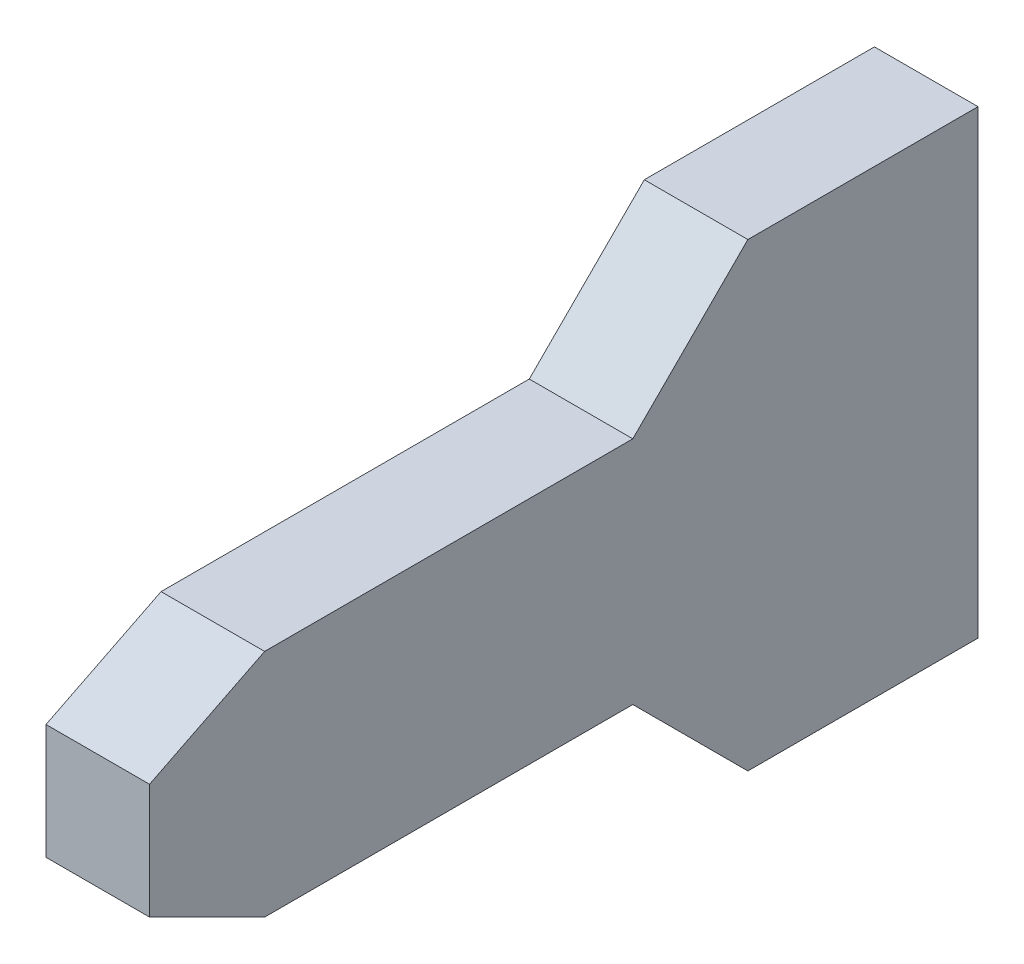
ISO-10303-21;
HEADER;
FILE_DESCRIPTION(('STEP AP214'),'2;1');
FILE_NAME('part.step','',(''),(''),'','','');
FILE_SCHEMA(('AUTOMOTIVE_DESIGN { 1 0 10303 214 1 1 1 1 }'));
ENDSEC;
DATA;
#1=APPLICATION_CONTEXT('core data for automotive mechanical design processes');
#2=APPLICATION_PROTOCOL_DEFINITION('international standard','automotive_design',2000,#1);
#3=PRODUCT_CONTEXT('',#1,'mechanical');
#4=PRODUCT('Part','Part','',(#3));
#5=PRODUCT_RELATED_PRODUCT_CATEGORY('part','',(#4));
#6=PRODUCT_DEFINITION_FORMATION('','',#4);
#7=PRODUCT_DEFINITION_CONTEXT('part definition',#1,'design');
#8=PRODUCT_DEFINITION('design','',#6,#7);
#9=PRODUCT_DEFINITION_SHAPE('','',#8);
#10=(LENGTH_UNIT() NAMED_UNIT(*) SI_UNIT(.MILLI.,.METRE.));
#11=(NAMED_UNIT(*) PLANE_ANGLE_UNIT() SI_UNIT($,.RADIAN.));
#12=(NAMED_UNIT(*) SI_UNIT($,.STERADIAN.) SOLID_ANGLE_UNIT());
#13=UNCERTAINTY_MEASURE_WITH_UNIT(LENGTH_MEASURE(1.E-05),#10,'distance_accuracy_value','');
#14=(GEOMETRIC_REPRESENTATION_CONTEXT(3) GLOBAL_UNCERTAINTY_ASSIGNED_CONTEXT((#13)) GLOBAL_UNIT_ASSIGNED_CONTEXT((#10,
#11,#12)) REPRESENTATION_CONTEXT('',''));
#15=CARTESIAN_POINT('',(0.,0.,0.));
#16=DIRECTION('',(0.,0.,1.));
#17=DIRECTION('',(1.,0.,0.));
#18=AXIS2_PLACEMENT_3D('',#15,#16,#17);
#19=CARTESIAN_POINT('',(0.45,0.,0.531743708992));
#20=DIRECTION('',(1.,0.,0.));
#21=DIRECTION('',(0.,1.,0.));
#22=AXIS2_PLACEMENT_3D('',#19,#20,#21);
#23=PLANE('',#22);
#24=DIRECTION('',(0.,0.,1.));
#25=VECTOR('',#24,1.);
#26=CARTESIAN_POINT('',(0.45,-0.5,0.531743708992));
#27=LINE('',#26,#25);
#28=CARTESIAN_POINT('',(0.45,-0.5,2.1));
#29=VERTEX_POINT('',#28);
#30=CARTESIAN_POINT('',(0.45,-0.5,0.5));
#31=VERTEX_POINT('',#30);
#32=EDGE_CURVE('E121',#29,#31,#27,.F.);
#33=ORIENTED_EDGE('',*,*,#32,.T.);
#34=DIRECTION('',(0.,-0.707106781186548,-0.707106781186547));
#35=VECTOR('',#34,1.);
#36=CARTESIAN_POINT('',(0.45,-0.5,0.5));
#37=LINE('',#36,#35);
#38=CARTESIAN_POINT('',(0.45,-1.,0.));
#39=VERTEX_POINT('',#38);
#40=EDGE_CURVE('E123',#31,#39,#37,.T.);
#41=ORIENTED_EDGE('',*,*,#40,.T.);
#42=DIRECTION('',(0.,0.,1.));
#43=VECTOR('',#42,1.);
#44=CARTESIAN_POINT('',(0.45,-1.,-1.));
#45=LINE('',#44,#43);
#46=CARTESIAN_POINT('',(0.45,-1.,-1.));
#47=VERTEX_POINT('',#46);
#48=EDGE_CURVE('E125',#47,#39,#45,.T.);
#49=ORIENTED_EDGE('',*,*,#48,.F.);
#50=DIRECTION('',(0.,1.,0.));
#51=VECTOR('',#50,1.);
#52=CARTESIAN_POINT('',(0.45,1.,-1.));
#53=LINE('',#52,#51);
#54=CARTESIAN_POINT('',(0.45,1.,-1.));
#55=VERTEX_POINT('',#54);
#56=EDGE_CURVE('E96',#55,#47,#53,.F.);
#57=ORIENTED_EDGE('',*,*,#56,.F.);
#58=DIRECTION('',(0.,0.,1.));
#59=VECTOR('',#58,1.);
#60=CARTESIAN_POINT('',(0.45,1.,0.531743708992));
#61=LINE('',#60,#59);
#62=CARTESIAN_POINT('',(0.45,1.,0.));
#63=VERTEX_POINT('',#62);
#64=EDGE_CURVE('E20',#55,#63,#61,.T.);
#65=ORIENTED_EDGE('',*,*,#64,.T.);
#66=DIRECTION('',(0.,-0.707106781186548,0.707106781186548));
#67=VECTOR('',#66,1.);
#68=CARTESIAN_POINT('',(0.450000000000001,1.,0.));
#69=LINE('',#68,#67);
#70=CARTESIAN_POINT('',(0.45,0.5,0.5));
#71=VERTEX_POINT('',#70);
#72=EDGE_CURVE('E91',#63,#71,#69,.T.);
#73=ORIENTED_EDGE('',*,*,#72,.T.);
#74=DIRECTION('',(0.,0.,1.));
#75=VECTOR('',#74,1.);
#76=CARTESIAN_POINT('',(0.45,0.5,0.531743708992));
#77=LINE('',#76,#75);
#78=CARTESIAN_POINT('',(0.45,0.5,2.1));
#79=VERTEX_POINT('',#78);
#80=EDGE_CURVE('E112',#71,#79,#77,.T.);
#81=ORIENTED_EDGE('',*,*,#80,.T.);
#82=DIRECTION('',(0.,-0.447213595499958,0.894427190999916));
#83=VECTOR('',#82,1.);
#84=CARTESIAN_POINT('',(0.45,0.5,2.1));
#85=LINE('',#84,#83);
#86=CARTESIAN_POINT('',(0.45,0.25,2.6));
#87=VERTEX_POINT('',#86);
#88=EDGE_CURVE('E113',#79,#87,#85,.T.);
#89=ORIENTED_EDGE('',*,*,#88,.T.);
#90=DIRECTION('',(0.,1.,0.));
#91=VECTOR('',#90,1.);
#92=CARTESIAN_POINT('',(0.45,0.,2.6));
#93=LINE('',#92,#91);
#94=CARTESIAN_POINT('',(0.45,-0.25,2.6));
#95=VERTEX_POINT('',#94);
#96=EDGE_CURVE('E117',#87,#95,#93,.F.);
#97=ORIENTED_EDGE('',*,*,#96,.T.);
#98=DIRECTION('',(0.,-0.447213595499958,-0.894427190999916));
#99=VECTOR('',#98,1.);
#100=CARTESIAN_POINT('',(0.45,-0.25,2.6));
#101=LINE('',#100,#99);
#102=EDGE_CURVE('E119',#95,#29,#101,.T.);
#103=ORIENTED_EDGE('',*,*,#102,.T.);
#104=EDGE_LOOP('',(#33,#41,#49,#57,#65,#73,#81,#89,#97,#103));
#105=FACE_BOUND('',#104,.T.);
#106=ADVANCED_FACE('F17',(#105),#23,.T.);
#107=CARTESIAN_POINT('',(0.,-1.,-1.));
#108=DIRECTION('',(0.,-1.,0.));
#109=DIRECTION('',(1.,0.,0.));
#110=AXIS2_PLACEMENT_3D('',#107,#108,#109);
#111=PLANE('',#110);
#112=DIRECTION('',(1.,0.,0.));
#113=VECTOR('',#112,1.);
#114=CARTESIAN_POINT('',(0.,-1.,0.));
#115=LINE('',#114,#113);
#116=CARTESIAN_POINT('',(0.,-1.,0.));
#117=VERTEX_POINT('',#116);
#118=EDGE_CURVE('E141',#117,#39,#115,.T.);
#119=ORIENTED_EDGE('',*,*,#118,.F.);
#120=DIRECTION('',(0.,0.,1.));
#121=VECTOR('',#120,1.);
#122=CARTESIAN_POINT('',(0.,-1.,0.531743708992));
#123=LINE('',#122,#121);
#124=CARTESIAN_POINT('',(0.,-1.,-1.));
#125=VERTEX_POINT('',#124);
#126=EDGE_CURVE('E145',#117,#125,#123,.F.);
#127=ORIENTED_EDGE('',*,*,#126,.T.);
#128=DIRECTION('',(-1.,0.,0.));
#129=VECTOR('',#128,1.);
#130=CARTESIAN_POINT('',(0.,-1.,-0.999999999999999));
#131=LINE('',#130,#129);
#132=EDGE_CURVE('E129',#47,#125,#131,.T.);
#133=ORIENTED_EDGE('',*,*,#132,.F.);
#134=ORIENTED_EDGE('',*,*,#48,.T.);
#135=EDGE_LOOP('',(#119,#127,#133,#134));
#136=FACE_BOUND('',#135,.T.);
#137=ADVANCED_FACE('F198',(#136),#111,.T.);
#138=CARTESIAN_POINT('',(0.,1.,-1.));
#139=DIRECTION('',(0.,0.,-1.));
#140=DIRECTION('',(-1.,0.,0.));
#141=AXIS2_PLACEMENT_3D('',#138,#139,#140);
#142=PLANE('',#141);
#143=ORIENTED_EDGE('',*,*,#132,.T.);
#144=DIRECTION('',(0.,1.,0.));
#145=VECTOR('',#144,1.);
#146=CARTESIAN_POINT('',(0.,0.,-1.));
#147=LINE('',#146,#145);
#148=CARTESIAN_POINT('',(0.,1.,-1.));
#149=VERTEX_POINT('',#148);
#150=EDGE_CURVE('E148',#125,#149,#147,.T.);
#151=ORIENTED_EDGE('',*,*,#150,.T.);
#152=DIRECTION('',(-1.,0.,0.));
#153=VECTOR('',#152,1.);
#154=CARTESIAN_POINT('',(0.,1.,-1.));
#155=LINE('',#154,#153);
#156=EDGE_CURVE('E108',#55,#149,#155,.T.);
#157=ORIENTED_EDGE('',*,*,#156,.F.);
#158=ORIENTED_EDGE('',*,*,#56,.T.);
#159=EDGE_LOOP('',(#143,#151,#157,#158));
#160=FACE_BOUND('',#159,.T.);
#161=ADVANCED_FACE('F194',(#160),#142,.T.);
#162=CARTESIAN_POINT('',(0.,1.,0.));
#163=DIRECTION('',(0.,1.,0.));
#164=DIRECTION('',(-1.,0.,0.));
#165=AXIS2_PLACEMENT_3D('',#162,#163,#164);
#166=PLANE('',#165);
#167=ORIENTED_EDGE('',*,*,#156,.T.);
#168=DIRECTION('',(0.,0.,1.));
#169=VECTOR('',#168,1.);
#170=CARTESIAN_POINT('',(0.,1.,0.531743708992));
#171=LINE('',#170,#169);
#172=CARTESIAN_POINT('',(0.,1.,0.));
#173=VERTEX_POINT('',#172);
#174=EDGE_CURVE('E103',#149,#173,#171,.T.);
#175=ORIENTED_EDGE('',*,*,#174,.T.);
#176=DIRECTION('',(1.,0.,0.));
#177=VECTOR('',#176,1.);
#178=CARTESIAN_POINT('',(0.,1.,0.));
#179=LINE('',#178,#177);
#180=EDGE_CURVE('E100',#63,#173,#179,.F.);
#181=ORIENTED_EDGE('',*,*,#180,.F.);
#182=ORIENTED_EDGE('',*,*,#64,.F.);
#183=EDGE_LOOP('',(#167,#175,#181,#182));
#184=FACE_BOUND('',#183,.T.);
#185=ADVANCED_FACE('F101',(#184),#166,.T.);
#186=CARTESIAN_POINT('',(0.,0.5,0.5));
#187=DIRECTION('',(0.,0.707106781186548,0.707106781186548));
#188=DIRECTION('',(0.,-0.707106781186548,0.707106781186548));
#189=AXIS2_PLACEMENT_3D('',#186,#187,#188);
#190=PLANE('',#189);
#191=ORIENTED_EDGE('',*,*,#180,.T.);
#192=DIRECTION('',(0.,-0.707106781186548,0.707106781186548));
#193=VECTOR('',#192,1.);
#194=CARTESIAN_POINT('',(0.,1.,0.));
#195=LINE('',#194,#193);
#196=CARTESIAN_POINT('',(0.,0.5,0.5));
#197=VERTEX_POINT('',#196);
#198=EDGE_CURVE('E152',#173,#197,#195,.T.);
#199=ORIENTED_EDGE('',*,*,#198,.T.);
#200=DIRECTION('',(-1.,0.,0.));
#201=VECTOR('',#200,1.);
#202=CARTESIAN_POINT('',(0.,0.5,0.5));
#203=LINE('',#202,#201);
#204=EDGE_CURVE('E107',#71,#197,#203,.T.);
#205=ORIENTED_EDGE('',*,*,#204,.F.);
#206=ORIENTED_EDGE('',*,*,#72,.F.);
#207=EDGE_LOOP('',(#191,#199,#205,#206));
#208=FACE_BOUND('',#207,.T.);
#209=ADVANCED_FACE('F110',(#208),#190,.T.);
#210=CARTESIAN_POINT('',(0.,0.5,2.1));
#211=DIRECTION('',(0.,1.,0.));
#212=DIRECTION('',(-1.,0.,0.));
#213=AXIS2_PLACEMENT_3D('',#210,#211,#212);
#214=PLANE('',#213);
#215=ORIENTED_EDGE('',*,*,#204,.T.);
#216=DIRECTION('',(0.,0.,1.));
#217=VECTOR('',#216,1.);
#218=CARTESIAN_POINT('',(0.,0.5,0.531743708992));
#219=LINE('',#218,#217);
#220=CARTESIAN_POINT('',(0.,0.5,2.1));
#221=VERTEX_POINT('',#220);
#222=EDGE_CURVE('E154',#197,#221,#219,.T.);
#223=ORIENTED_EDGE('',*,*,#222,.T.);
#224=DIRECTION('',(1.,0.,0.));
#225=VECTOR('',#224,1.);
#226=CARTESIAN_POINT('',(0.,0.5,2.1));
#227=LINE('',#226,#225);
#228=EDGE_CURVE('E133',#79,#221,#227,.F.);
#229=ORIENTED_EDGE('',*,*,#228,.F.);
#230=ORIENTED_EDGE('',*,*,#80,.F.);
#231=EDGE_LOOP('',(#215,#223,#229,#230));
#232=FACE_BOUND('',#231,.T.);
#233=ADVANCED_FACE('F191',(#232),#214,.T.);
#234=CARTESIAN_POINT('',(0.,0.25,2.6));
#235=DIRECTION('',(0.,0.894427190999916,0.447213595499958));
#236=DIRECTION('',(0.,-0.447213595499958,0.894427190999916));
#237=AXIS2_PLACEMENT_3D('',#234,#235,#236);
#238=PLANE('',#237);
#239=ORIENTED_EDGE('',*,*,#228,.T.);
#240=DIRECTION('',(0.,-0.447213595499958,0.894427190999916));
#241=VECTOR('',#240,1.);
#242=CARTESIAN_POINT('',(0.,0.5,2.1));
#243=LINE('',#242,#241);
#244=CARTESIAN_POINT('',(0.,0.25,2.6));
#245=VERTEX_POINT('',#244);
#246=EDGE_CURVE('E157',#221,#245,#243,.T.);
#247=ORIENTED_EDGE('',*,*,#246,.T.);
#248=DIRECTION('',(1.,0.,0.));
#249=VECTOR('',#248,1.);
#250=CARTESIAN_POINT('',(0.,0.25,2.6));
#251=LINE('',#250,#249);
#252=EDGE_CURVE('E135',#87,#245,#251,.F.);
#253=ORIENTED_EDGE('',*,*,#252,.F.);
#254=ORIENTED_EDGE('',*,*,#88,.F.);
#255=EDGE_LOOP('',(#239,#247,#253,#254));
#256=FACE_BOUND('',#255,.T.);
#257=ADVANCED_FACE('F187',(#256),#238,.T.);
#258=CARTESIAN_POINT('',(0.,-0.25,2.6));
#259=DIRECTION('',(0.,0.,1.));
#260=DIRECTION('',(0.,-1.,0.));
#261=AXIS2_PLACEMENT_3D('',#258,#259,#260);
#262=PLANE('',#261);
#263=ORIENTED_EDGE('',*,*,#252,.T.);
#264=DIRECTION('',(0.,1.,0.));
#265=VECTOR('',#264,1.);
#266=CARTESIAN_POINT('',(0.,0.,2.6));
#267=LINE('',#266,#265);
#268=CARTESIAN_POINT('',(0.,-0.25,2.6));
#269=VERTEX_POINT('',#268);
#270=EDGE_CURVE('E160',#245,#269,#267,.F.);
#271=ORIENTED_EDGE('',*,*,#270,.T.);
#272=DIRECTION('',(1.,0.,0.));
#273=VECTOR('',#272,1.);
#274=CARTESIAN_POINT('',(0.,-0.25,2.6));
#275=LINE('',#274,#273);
#276=EDGE_CURVE('E137',#95,#269,#275,.F.);
#277=ORIENTED_EDGE('',*,*,#276,.F.);
#278=ORIENTED_EDGE('',*,*,#96,.F.);
#279=EDGE_LOOP('',(#263,#271,#277,#278));
#280=FACE_BOUND('',#279,.T.);
#281=ADVANCED_FACE('F182',(#280),#262,.T.);
#282=CARTESIAN_POINT('',(0.,-0.5,2.1));
#283=DIRECTION('',(0.,-0.894427190999916,0.447213595499958));
#284=DIRECTION('',(0.,-0.447213595499958,-0.894427190999916));
#285=AXIS2_PLACEMENT_3D('',#282,#283,#284);
#286=PLANE('',#285);
#287=ORIENTED_EDGE('',*,*,#276,.T.);
#288=DIRECTION('',(0.,-0.447213595499958,-0.894427190999916));
#289=VECTOR('',#288,1.);
#290=CARTESIAN_POINT('',(0.,-0.25,2.6));
#291=LINE('',#290,#289);
#292=CARTESIAN_POINT('',(0.,-0.5,2.1));
#293=VERTEX_POINT('',#292);
#294=EDGE_CURVE('E163',#269,#293,#291,.T.);
#295=ORIENTED_EDGE('',*,*,#294,.T.);
#296=DIRECTION('',(1.,0.,0.));
#297=VECTOR('',#296,1.);
#298=CARTESIAN_POINT('',(0.,-0.5,2.1));
#299=LINE('',#298,#297);
#300=EDGE_CURVE('E139',#29,#293,#299,.F.);
#301=ORIENTED_EDGE('',*,*,#300,.F.);
#302=ORIENTED_EDGE('',*,*,#102,.F.);
#303=EDGE_LOOP('',(#287,#295,#301,#302));
#304=FACE_BOUND('',#303,.T.);
#305=ADVANCED_FACE('F177',(#304),#286,.T.);
#306=CARTESIAN_POINT('',(0.,-0.5,0.5));
#307=DIRECTION('',(0.,-1.,0.));
#308=DIRECTION('',(1.,0.,0.));
#309=AXIS2_PLACEMENT_3D('',#306,#307,#308);
#310=PLANE('',#309);
#311=ORIENTED_EDGE('',*,*,#300,.T.);
#312=DIRECTION('',(0.,0.,1.));
#313=VECTOR('',#312,1.);
#314=CARTESIAN_POINT('',(0.,-0.5,0.531743708992));
#315=LINE('',#314,#313);
#316=CARTESIAN_POINT('',(0.,-0.5,0.5));
#317=VERTEX_POINT('',#316);
#318=EDGE_CURVE('E26',#293,#317,#315,.F.);
#319=ORIENTED_EDGE('',*,*,#318,.T.);
#320=DIRECTION('',(1.,0.,0.));
#321=VECTOR('',#320,1.);
#322=CARTESIAN_POINT('',(0.,-0.5,0.5));
#323=LINE('',#322,#321);
#324=EDGE_CURVE('E34',#31,#317,#323,.F.);
#325=ORIENTED_EDGE('',*,*,#324,.F.);
#326=ORIENTED_EDGE('',*,*,#32,.F.);
#327=EDGE_LOOP('',(#311,#319,#325,#326));
#328=FACE_BOUND('',#327,.T.);
#329=ADVANCED_FACE('F169',(#328),#310,.T.);
#330=CARTESIAN_POINT('',(0.,-1.,0.));
#331=DIRECTION('',(0.,-0.707106781186548,0.707106781186548));
#332=DIRECTION('',(0.,-0.707106781186548,-0.707106781186548));
#333=AXIS2_PLACEMENT_3D('',#330,#331,#332);
#334=PLANE('',#333);
#335=ORIENTED_EDGE('',*,*,#324,.T.);
#336=DIRECTION('',(0.,-0.707106781186548,-0.707106781186547));
#337=VECTOR('',#336,1.);
#338=CARTESIAN_POINT('',(0.,-0.5,0.5));
#339=LINE('',#338,#337);
#340=EDGE_CURVE('E11',#317,#117,#339,.T.);
#341=ORIENTED_EDGE('',*,*,#340,.T.);
#342=ORIENTED_EDGE('',*,*,#118,.T.);
#343=ORIENTED_EDGE('',*,*,#40,.F.);
#344=EDGE_LOOP('',(#335,#341,#342,#343));
#345=FACE_BOUND('',#344,.T.);
#346=ADVANCED_FACE('F199',(#345),#334,.T.);
#347=CARTESIAN_POINT('',(0.,0.,0.531743708992));
#348=DIRECTION('',(1.,0.,0.));
#349=DIRECTION('',(0.,1.,0.));
#350=AXIS2_PLACEMENT_3D('',#347,#348,#349);
#351=PLANE('',#350);
#352=ORIENTED_EDGE('',*,*,#318,.F.);
#353=ORIENTED_EDGE('',*,*,#294,.F.);
#354=ORIENTED_EDGE('',*,*,#270,.F.);
#355=ORIENTED_EDGE('',*,*,#246,.F.);
#356=ORIENTED_EDGE('',*,*,#222,.F.);
#357=ORIENTED_EDGE('',*,*,#198,.F.);
#358=ORIENTED_EDGE('',*,*,#174,.F.);
#359=ORIENTED_EDGE('',*,*,#150,.F.);
#360=ORIENTED_EDGE('',*,*,#126,.F.);
#361=ORIENTED_EDGE('',*,*,#340,.F.);
#362=EDGE_LOOP('',(#352,#353,#354,#355,#356,#357,#358,#359,#360,#361));
#363=FACE_BOUND('',#362,.T.);
#364=ADVANCED_FACE('F174',(#363),#351,.F.);
#365=CLOSED_SHELL('',(#106,#137,#161,#185,#209,#233,#257,#281,#305,#329,#346,#364));
#366=MANIFOLD_SOLID_BREP('B1',#365);
#367=ADVANCED_BREP_SHAPE_REPRESENTATION('',(#18,#366),#14);
#368=SHAPE_DEFINITION_REPRESENTATION(#9,#367);
ENDSEC;
END-ISO-10303-21;
